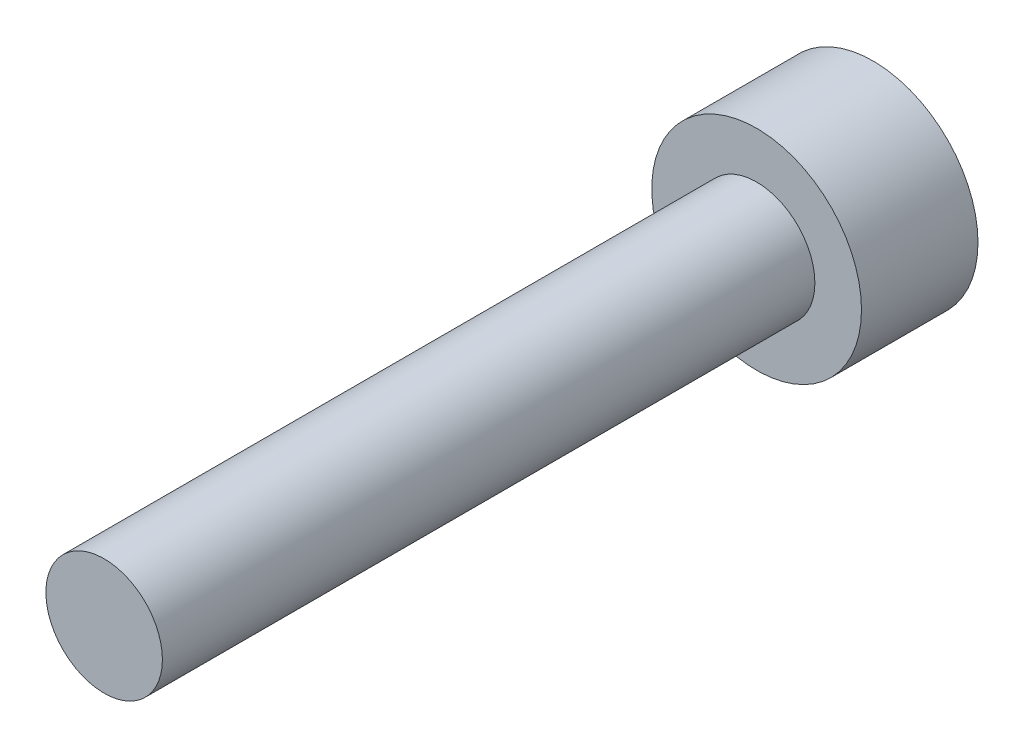
ISO-10303-21;
HEADER;
FILE_DESCRIPTION(('STEP AP214'),'2;1');
FILE_NAME('part.step','',(''),(''),'','','');
FILE_SCHEMA(('AUTOMOTIVE_DESIGN { 1 0 10303 214 1 1 1 1 }'));
ENDSEC;
DATA;
#1=APPLICATION_CONTEXT('core data for automotive mechanical design processes');
#2=APPLICATION_PROTOCOL_DEFINITION('international standard','automotive_design',2000,#1);
#3=PRODUCT_CONTEXT('',#1,'mechanical');
#4=PRODUCT('Part','Part','',(#3));
#5=PRODUCT_RELATED_PRODUCT_CATEGORY('part','',(#4));
#6=PRODUCT_DEFINITION_FORMATION('','',#4);
#7=PRODUCT_DEFINITION_CONTEXT('part definition',#1,'design');
#8=PRODUCT_DEFINITION('design','',#6,#7);
#9=PRODUCT_DEFINITION_SHAPE('','',#8);
#10=(LENGTH_UNIT() NAMED_UNIT(*) SI_UNIT(.MILLI.,.METRE.));
#11=(NAMED_UNIT(*) PLANE_ANGLE_UNIT() SI_UNIT($,.RADIAN.));
#12=(NAMED_UNIT(*) SI_UNIT($,.STERADIAN.) SOLID_ANGLE_UNIT());
#13=UNCERTAINTY_MEASURE_WITH_UNIT(LENGTH_MEASURE(1.E-05),#10,'distance_accuracy_value','');
#14=(GEOMETRIC_REPRESENTATION_CONTEXT(3) GLOBAL_UNCERTAINTY_ASSIGNED_CONTEXT((#13)) GLOBAL_UNIT_ASSIGNED_CONTEXT((#10,
#11,#12)) REPRESENTATION_CONTEXT('',''));
#15=CARTESIAN_POINT('',(0.,0.,0.));
#16=DIRECTION('',(0.,0.,1.));
#17=DIRECTION('',(1.,0.,0.));
#18=AXIS2_PLACEMENT_3D('',#15,#16,#17);
#19=CARTESIAN_POINT('',(0.,0.,-2.5));
#20=DIRECTION('',(0.,0.,1.));
#21=DIRECTION('',(1.,0.,0.));
#22=AXIS2_PLACEMENT_3D('',#19,#20,#21);
#23=PLANE('',#22);
#24=CARTESIAN_POINT('',(0.,0.,-2.5));
#25=DIRECTION('',(0.,0.,1.));
#26=DIRECTION('',(1.,0.,0.));
#27=AXIS2_PLACEMENT_3D('',#24,#25,#26);
#28=CIRCLE('',#27,2.25);
#29=CARTESIAN_POINT('',(2.25,0.,-2.5));
#30=VERTEX_POINT('',#29);
#31=EDGE_CURVE('E47',#30,#30,#28,.T.);
#32=ORIENTED_EDGE('',*,*,#31,.F.);
#33=EDGE_LOOP('',(#32));
#34=FACE_BOUND('',#33,.T.);
#35=DIRECTION('',(0.5,0.866025403784439,0.));
#36=VECTOR('',#35,1.);
#37=CARTESIAN_POINT('',(0.577350269189626,-1.,-2.5));
#38=LINE('',#37,#36);
#39=CARTESIAN_POINT('',(0.577350269189626,-1.,-2.5));
#40=VERTEX_POINT('',#39);
#41=CARTESIAN_POINT('',(1.15470053837925,0.,-2.5));
#42=VERTEX_POINT('',#41);
#43=EDGE_CURVE('E62',#40,#42,#38,.T.);
#44=ORIENTED_EDGE('',*,*,#43,.T.);
#45=DIRECTION('',(-0.5,0.866025403784439,0.));
#46=VECTOR('',#45,1.);
#47=CARTESIAN_POINT('',(1.15470053837925,0.,-2.5));
#48=LINE('',#47,#46);
#49=CARTESIAN_POINT('',(0.577350269189626,1.,-2.5));
#50=VERTEX_POINT('',#49);
#51=EDGE_CURVE('E138',#42,#50,#48,.T.);
#52=ORIENTED_EDGE('',*,*,#51,.T.);
#53=DIRECTION('',(-1.,0.,0.));
#54=VECTOR('',#53,1.);
#55=CARTESIAN_POINT('',(0.577350269189626,1.,-2.5));
#56=LINE('',#55,#54);
#57=CARTESIAN_POINT('',(-0.577350269189626,1.,-2.5));
#58=VERTEX_POINT('',#57);
#59=EDGE_CURVE('E141',#50,#58,#56,.T.);
#60=ORIENTED_EDGE('',*,*,#59,.T.);
#61=DIRECTION('',(-0.5,-0.866025403784438,0.));
#62=VECTOR('',#61,1.);
#63=CARTESIAN_POINT('',(-0.577350269189626,1.,-2.5));
#64=LINE('',#63,#62);
#65=CARTESIAN_POINT('',(-1.15470053837925,0.,-2.5));
#66=VERTEX_POINT('',#65);
#67=EDGE_CURVE('E150',#58,#66,#64,.T.);
#68=ORIENTED_EDGE('',*,*,#67,.T.);
#69=DIRECTION('',(0.5,-0.866025403784439,0.));
#70=VECTOR('',#69,1.);
#71=CARTESIAN_POINT('',(-1.15470053837925,0.,-2.5));
#72=LINE('',#71,#70);
#73=CARTESIAN_POINT('',(-0.577350269189626,-1.,-2.5));
#74=VERTEX_POINT('',#73);
#75=EDGE_CURVE('E125',#66,#74,#72,.T.);
#76=ORIENTED_EDGE('',*,*,#75,.T.);
#77=DIRECTION('',(1.,0.,0.));
#78=VECTOR('',#77,1.);
#79=CARTESIAN_POINT('',(-0.577350269189626,-1.,-2.5));
#80=LINE('',#79,#78);
#81=EDGE_CURVE('E155',#74,#40,#80,.T.);
#82=ORIENTED_EDGE('',*,*,#81,.T.);
#83=EDGE_LOOP('',(#44,#52,#60,#68,#76,#82));
#84=FACE_BOUND('',#83,.T.);
#85=ADVANCED_FACE('F44',(#34,#84),#23,.F.);
#86=CARTESIAN_POINT('',(0.,0.,0.));
#87=DIRECTION('',(0.,0.,-1.));
#88=DIRECTION('',(-1.,0.,0.));
#89=AXIS2_PLACEMENT_3D('',#86,#87,#88);
#90=CYLINDRICAL_SURFACE('',#89,2.25);
#91=CARTESIAN_POINT('',(0.,0.,0.));
#92=DIRECTION('',(0.,0.,1.));
#93=DIRECTION('',(1.,0.,0.));
#94=AXIS2_PLACEMENT_3D('',#91,#92,#93);
#95=CIRCLE('',#94,2.25);
#96=CARTESIAN_POINT('',(2.25,0.,0.));
#97=VERTEX_POINT('',#96);
#98=EDGE_CURVE('E54',#97,#97,#95,.T.);
#99=ORIENTED_EDGE('',*,*,#98,.F.);
#100=EDGE_LOOP('',(#99));
#101=FACE_BOUND('',#100,.T.);
#102=ORIENTED_EDGE('',*,*,#31,.T.);
#103=EDGE_LOOP('',(#102));
#104=FACE_BOUND('',#103,.T.);
#105=ADVANCED_FACE('F50',(#101,#104),#90,.T.);
#106=CARTESIAN_POINT('',(0.,0.,0.));
#107=DIRECTION('',(0.,0.,1.));
#108=DIRECTION('',(1.,0.,0.));
#109=AXIS2_PLACEMENT_3D('',#106,#107,#108);
#110=PLANE('',#109);
#111=CARTESIAN_POINT('',(0.,0.,0.));
#112=DIRECTION('',(0.,0.,1.));
#113=DIRECTION('',(1.,0.,0.));
#114=AXIS2_PLACEMENT_3D('',#111,#112,#113);
#115=CIRCLE('',#114,1.25);
#116=CARTESIAN_POINT('',(1.25,0.,0.));
#117=VERTEX_POINT('',#116);
#118=EDGE_CURVE('E11',#117,#117,#115,.T.);
#119=ORIENTED_EDGE('',*,*,#118,.F.);
#120=EDGE_LOOP('',(#119));
#121=FACE_BOUND('',#120,.T.);
#122=ORIENTED_EDGE('',*,*,#98,.T.);
#123=EDGE_LOOP('',(#122));
#124=FACE_BOUND('',#123,.T.);
#125=ADVANCED_FACE('F212',(#121,#124),#110,.T.);
#126=CARTESIAN_POINT('',(0.,0.,14.));
#127=DIRECTION('',(0.,0.,-1.));
#128=DIRECTION('',(-1.,0.,0.));
#129=AXIS2_PLACEMENT_3D('',#126,#127,#128);
#130=CYLINDRICAL_SURFACE('',#129,1.25);
#131=CARTESIAN_POINT('',(0.,0.,14.));
#132=DIRECTION('',(0.,0.,1.));
#133=DIRECTION('',(1.,0.,0.));
#134=AXIS2_PLACEMENT_3D('',#131,#132,#133);
#135=CIRCLE('',#134,1.25);
#136=CARTESIAN_POINT('',(1.25,0.,14.));
#137=VERTEX_POINT('',#136);
#138=EDGE_CURVE('E166',#137,#137,#135,.T.);
#139=ORIENTED_EDGE('',*,*,#138,.F.);
#140=EDGE_LOOP('',(#139));
#141=FACE_BOUND('',#140,.T.);
#142=ORIENTED_EDGE('',*,*,#118,.T.);
#143=EDGE_LOOP('',(#142));
#144=FACE_BOUND('',#143,.T.);
#145=ADVANCED_FACE('F209',(#141,#144),#130,.T.);
#146=CARTESIAN_POINT('',(0.,0.,14.));
#147=DIRECTION('',(0.,0.,1.));
#148=DIRECTION('',(1.,0.,0.));
#149=AXIS2_PLACEMENT_3D('',#146,#147,#148);
#150=PLANE('',#149);
#151=ORIENTED_EDGE('',*,*,#138,.T.);
#152=EDGE_LOOP('',(#151));
#153=FACE_BOUND('',#152,.T.);
#154=ADVANCED_FACE('F204',(#153),#150,.T.);
#155=CARTESIAN_POINT('',(0.577350269189626,-1.,-1.4));
#156=DIRECTION('',(-0.866025403784439,0.5,0.));
#157=DIRECTION('',(-0.5,-0.866025403784439,0.));
#158=AXIS2_PLACEMENT_3D('',#155,#156,#157);
#159=PLANE('',#158);
#160=ORIENTED_EDGE('',*,*,#43,.F.);
#161=DIRECTION('',(0.,0.,-1.));
#162=VECTOR('',#161,1.);
#163=CARTESIAN_POINT('',(0.577350269189626,-1.,-1.4));
#164=LINE('',#163,#162);
#165=CARTESIAN_POINT('',(0.577350269189626,-1.,-1.4));
#166=VERTEX_POINT('',#165);
#167=EDGE_CURVE('E132',#166,#40,#164,.T.);
#168=ORIENTED_EDGE('',*,*,#167,.F.);
#169=DIRECTION('',(0.5,0.866025403784439,0.));
#170=VECTOR('',#169,1.);
#171=CARTESIAN_POINT('',(0.577350269189626,-1.,-1.4));
#172=LINE('',#171,#170);
#173=CARTESIAN_POINT('',(1.15470053837925,0.,-1.4));
#174=VERTEX_POINT('',#173);
#175=EDGE_CURVE('E156',#166,#174,#172,.T.);
#176=ORIENTED_EDGE('',*,*,#175,.T.);
#177=DIRECTION('',(0.,0.,-1.));
#178=VECTOR('',#177,1.);
#179=CARTESIAN_POINT('',(1.15470053837925,0.,-1.4));
#180=LINE('',#179,#178);
#181=EDGE_CURVE('E167',#174,#42,#180,.T.);
#182=ORIENTED_EDGE('',*,*,#181,.T.);
#183=EDGE_LOOP('',(#160,#168,#176,#182));
#184=FACE_BOUND('',#183,.T.);
#185=ADVANCED_FACE('F184',(#184),#159,.T.);
#186=CARTESIAN_POINT('',(1.15470053837925,0.,-1.4));
#187=DIRECTION('',(-0.866025403784439,-0.5,0.));
#188=DIRECTION('',(0.5,-0.866025403784439,0.));
#189=AXIS2_PLACEMENT_3D('',#186,#187,#188);
#190=PLANE('',#189);
#191=ORIENTED_EDGE('',*,*,#51,.F.);
#192=ORIENTED_EDGE('',*,*,#181,.F.);
#193=DIRECTION('',(-0.5,0.866025403784439,0.));
#194=VECTOR('',#193,1.);
#195=CARTESIAN_POINT('',(1.15470053837925,0.,-1.4));
#196=LINE('',#195,#194);
#197=CARTESIAN_POINT('',(0.577350269189626,1.,-1.4));
#198=VERTEX_POINT('',#197);
#199=EDGE_CURVE('E105',#174,#198,#196,.T.);
#200=ORIENTED_EDGE('',*,*,#199,.T.);
#201=DIRECTION('',(0.,0.,-1.));
#202=VECTOR('',#201,1.);
#203=CARTESIAN_POINT('',(0.577350269189626,1.,-1.4));
#204=LINE('',#203,#202);
#205=EDGE_CURVE('E162',#198,#50,#204,.T.);
#206=ORIENTED_EDGE('',*,*,#205,.T.);
#207=EDGE_LOOP('',(#191,#192,#200,#206));
#208=FACE_BOUND('',#207,.T.);
#209=ADVANCED_FACE('F198',(#208),#190,.T.);
#210=CARTESIAN_POINT('',(0.577350269189626,1.,-1.4));
#211=DIRECTION('',(0.,-1.,0.));
#212=DIRECTION('',(1.,0.,0.));
#213=AXIS2_PLACEMENT_3D('',#210,#211,#212);
#214=PLANE('',#213);
#215=ORIENTED_EDGE('',*,*,#59,.F.);
#216=ORIENTED_EDGE('',*,*,#205,.F.);
#217=DIRECTION('',(-1.,0.,0.));
#218=VECTOR('',#217,1.);
#219=CARTESIAN_POINT('',(0.577350269189626,1.,-1.4));
#220=LINE('',#219,#218);
#221=CARTESIAN_POINT('',(-0.577350269189626,1.,-1.4));
#222=VERTEX_POINT('',#221);
#223=EDGE_CURVE('E121',#198,#222,#220,.T.);
#224=ORIENTED_EDGE('',*,*,#223,.T.);
#225=DIRECTION('',(0.,0.,-1.));
#226=VECTOR('',#225,1.);
#227=CARTESIAN_POINT('',(-0.577350269189626,1.,-1.4));
#228=LINE('',#227,#226);
#229=EDGE_CURVE('E119',#222,#58,#228,.T.);
#230=ORIENTED_EDGE('',*,*,#229,.T.);
#231=EDGE_LOOP('',(#215,#216,#224,#230));
#232=FACE_BOUND('',#231,.T.);
#233=ADVANCED_FACE('F193',(#232),#214,.T.);
#234=CARTESIAN_POINT('',(-0.577350269189626,1.,-1.4));
#235=DIRECTION('',(0.866025403784438,-0.5,0.));
#236=DIRECTION('',(0.5,0.866025403784438,0.));
#237=AXIS2_PLACEMENT_3D('',#234,#235,#236);
#238=PLANE('',#237);
#239=ORIENTED_EDGE('',*,*,#67,.F.);
#240=ORIENTED_EDGE('',*,*,#229,.F.);
#241=DIRECTION('',(-0.5,-0.866025403784438,0.));
#242=VECTOR('',#241,1.);
#243=CARTESIAN_POINT('',(-0.577350269189626,1.,-1.4));
#244=LINE('',#243,#242);
#245=CARTESIAN_POINT('',(-1.15470053837925,0.,-1.4));
#246=VERTEX_POINT('',#245);
#247=EDGE_CURVE('E115',#222,#246,#244,.T.);
#248=ORIENTED_EDGE('',*,*,#247,.T.);
#249=DIRECTION('',(0.,0.,-1.));
#250=VECTOR('',#249,1.);
#251=CARTESIAN_POINT('',(-1.15470053837925,0.,-1.4));
#252=LINE('',#251,#250);
#253=EDGE_CURVE('E118',#246,#66,#252,.T.);
#254=ORIENTED_EDGE('',*,*,#253,.T.);
#255=EDGE_LOOP('',(#239,#240,#248,#254));
#256=FACE_BOUND('',#255,.T.);
#257=ADVANCED_FACE('F113',(#256),#238,.T.);
#258=CARTESIAN_POINT('',(-1.15470053837925,0.,-1.4));
#259=DIRECTION('',(0.866025403784439,0.5,0.));
#260=DIRECTION('',(-0.5,0.866025403784439,0.));
#261=AXIS2_PLACEMENT_3D('',#258,#259,#260);
#262=PLANE('',#261);
#263=ORIENTED_EDGE('',*,*,#75,.F.);
#264=ORIENTED_EDGE('',*,*,#253,.F.);
#265=DIRECTION('',(0.5,-0.866025403784439,0.));
#266=VECTOR('',#265,1.);
#267=CARTESIAN_POINT('',(-1.15470053837925,0.,-1.4));
#268=LINE('',#267,#266);
#269=CARTESIAN_POINT('',(-0.577350269189626,-1.,-1.4));
#270=VERTEX_POINT('',#269);
#271=EDGE_CURVE('E116',#246,#270,#268,.T.);
#272=ORIENTED_EDGE('',*,*,#271,.T.);
#273=DIRECTION('',(0.,0.,-1.));
#274=VECTOR('',#273,1.);
#275=CARTESIAN_POINT('',(-0.577350269189626,-1.,-1.4));
#276=LINE('',#275,#274);
#277=EDGE_CURVE('E91',#270,#74,#276,.T.);
#278=ORIENTED_EDGE('',*,*,#277,.T.);
#279=EDGE_LOOP('',(#263,#264,#272,#278));
#280=FACE_BOUND('',#279,.T.);
#281=ADVANCED_FACE('F124',(#280),#262,.T.);
#282=CARTESIAN_POINT('',(-0.577350269189626,-1.,-1.4));
#283=DIRECTION('',(0.,1.,0.));
#284=DIRECTION('',(0.,0.,1.));
#285=AXIS2_PLACEMENT_3D('',#282,#283,#284);
#286=PLANE('',#285);
#287=ORIENTED_EDGE('',*,*,#81,.F.);
#288=ORIENTED_EDGE('',*,*,#277,.F.);
#289=DIRECTION('',(1.,0.,0.));
#290=VECTOR('',#289,1.);
#291=CARTESIAN_POINT('',(-0.577350269189626,-1.,-1.4));
#292=LINE('',#291,#290);
#293=EDGE_CURVE('E72',#270,#166,#292,.T.);
#294=ORIENTED_EDGE('',*,*,#293,.T.);
#295=ORIENTED_EDGE('',*,*,#167,.T.);
#296=EDGE_LOOP('',(#287,#288,#294,#295));
#297=FACE_BOUND('',#296,.T.);
#298=ADVANCED_FACE('F181',(#297),#286,.T.);
#299=CARTESIAN_POINT('',(0.,0.,-1.4));
#300=DIRECTION('',(0.,0.,1.));
#301=DIRECTION('',(1.,0.,0.));
#302=AXIS2_PLACEMENT_3D('',#299,#300,#301);
#303=PLANE('',#302);
#304=ORIENTED_EDGE('',*,*,#175,.F.);
#305=ORIENTED_EDGE('',*,*,#293,.F.);
#306=ORIENTED_EDGE('',*,*,#271,.F.);
#307=ORIENTED_EDGE('',*,*,#247,.F.);
#308=ORIENTED_EDGE('',*,*,#223,.F.);
#309=ORIENTED_EDGE('',*,*,#199,.F.);
#310=EDGE_LOOP('',(#304,#305,#306,#307,#308,#309));
#311=FACE_BOUND('',#310,.T.);
#312=ADVANCED_FACE('F129',(#311),#303,.F.);
#313=CLOSED_SHELL('',(#85,#105,#125,#145,#154,#185,#209,#233,#257,#281,#298,#312));
#314=MANIFOLD_SOLID_BREP('B2',#313);
#315=ADVANCED_BREP_SHAPE_REPRESENTATION('',(#18,#314),#14);
#316=SHAPE_DEFINITION_REPRESENTATION(#9,#315);
ENDSEC;
END-ISO-10303-21;
